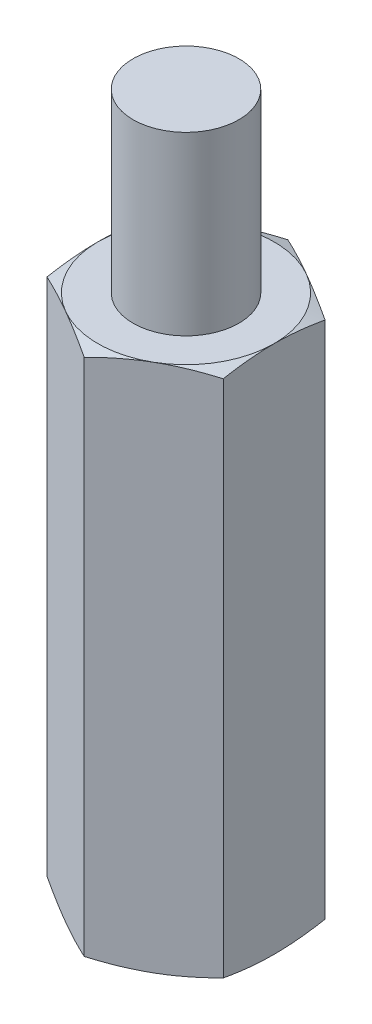
ISO-10303-21;
HEADER;
FILE_DESCRIPTION(('STEP AP214'),'2;1');
FILE_NAME('part.step','',(''),(''),'','','');
FILE_SCHEMA(('AUTOMOTIVE_DESIGN { 1 0 10303 214 1 1 1 1 }'));
ENDSEC;
DATA;
#1=APPLICATION_CONTEXT('core data for automotive mechanical design processes');
#2=APPLICATION_PROTOCOL_DEFINITION('international standard','automotive_design',2000,#1);
#3=PRODUCT_CONTEXT('',#1,'mechanical');
#4=PRODUCT('Part','Part','',(#3));
#5=PRODUCT_RELATED_PRODUCT_CATEGORY('part','',(#4));
#6=PRODUCT_DEFINITION_FORMATION('','',#4);
#7=PRODUCT_DEFINITION_CONTEXT('part definition',#1,'design');
#8=PRODUCT_DEFINITION('design','',#6,#7);
#9=PRODUCT_DEFINITION_SHAPE('','',#8);
#10=(LENGTH_UNIT() NAMED_UNIT(*) SI_UNIT(.MILLI.,.METRE.));
#11=(NAMED_UNIT(*) PLANE_ANGLE_UNIT() SI_UNIT($,.RADIAN.));
#12=(NAMED_UNIT(*) SI_UNIT($,.STERADIAN.) SOLID_ANGLE_UNIT());
#13=UNCERTAINTY_MEASURE_WITH_UNIT(LENGTH_MEASURE(1.E-05),#10,'distance_accuracy_value','');
#14=(GEOMETRIC_REPRESENTATION_CONTEXT(3) GLOBAL_UNCERTAINTY_ASSIGNED_CONTEXT((#13)) GLOBAL_UNIT_ASSIGNED_CONTEXT((#10,
#11,#12)) REPRESENTATION_CONTEXT('',''));
#15=CARTESIAN_POINT('',(0.,0.,0.));
#16=DIRECTION('',(0.,0.,1.));
#17=DIRECTION('',(1.,0.,0.));
#18=AXIS2_PLACEMENT_3D('',#15,#16,#17);
#19=CARTESIAN_POINT('',(0.,20.,0.));
#20=DIRECTION('',(0.,-1.,0.));
#21=DIRECTION('',(0.,0.,-1.));
#22=AXIS2_PLACEMENT_3D('',#19,#20,#21);
#23=CYLINDRICAL_SURFACE('',#22,1.5);
#24=CARTESIAN_POINT('',(0.,20.,0.));
#25=DIRECTION('',(0.,1.,0.));
#26=DIRECTION('',(0.,0.,1.));
#27=AXIS2_PLACEMENT_3D('',#24,#25,#26);
#28=CIRCLE('',#27,1.5);
#29=CARTESIAN_POINT('',(0.,20.,1.5));
#30=VERTEX_POINT('',#29);
#31=EDGE_CURVE('E11',#30,#30,#28,.T.);
#32=ORIENTED_EDGE('',*,*,#31,.F.);
#33=EDGE_LOOP('',(#32));
#34=FACE_BOUND('',#33,.T.);
#35=CARTESIAN_POINT('',(0.,15.,0.));
#36=DIRECTION('',(0.,1.,0.));
#37=DIRECTION('',(0.,0.,1.));
#38=AXIS2_PLACEMENT_3D('',#35,#36,#37);
#39=CIRCLE('',#38,1.5);
#40=CARTESIAN_POINT('',(0.,15.,1.5));
#41=VERTEX_POINT('',#40);
#42=EDGE_CURVE('E52',#41,#41,#39,.T.);
#43=ORIENTED_EDGE('',*,*,#42,.T.);
#44=EDGE_LOOP('',(#43));
#45=FACE_BOUND('',#44,.T.);
#46=ADVANCED_FACE('F49',(#34,#45),#23,.T.);
#47=CARTESIAN_POINT('',(0.,20.,0.));
#48=DIRECTION('',(0.,1.,0.));
#49=DIRECTION('',(0.,0.,1.));
#50=AXIS2_PLACEMENT_3D('',#47,#48,#49);
#51=PLANE('',#50);
#52=ORIENTED_EDGE('',*,*,#31,.T.);
#53=EDGE_LOOP('',(#52));
#54=FACE_BOUND('',#53,.T.);
#55=ADVANCED_FACE('F64',(#54),#51,.T.);
#56=CARTESIAN_POINT('',(0.,15.,0.));
#57=DIRECTION('',(0.,1.,0.));
#58=DIRECTION('',(0.,0.,1.));
#59=AXIS2_PLACEMENT_3D('',#56,#57,#58);
#60=PLANE('',#59);
#61=ORIENTED_EDGE('',*,*,#42,.F.);
#62=EDGE_LOOP('',(#61));
#63=FACE_BOUND('',#62,.T.);
#64=ADVANCED_FACE('F62',(#63),#60,.F.);
#65=CLOSED_SHELL('',(#46,#55,#64));
#66=MANIFOLD_SOLID_BREP('B2',#65);
#67=CARTESIAN_POINT('',(0.,15.,0.));
#68=DIRECTION('',(0.,1.,0.));
#69=DIRECTION('',(0.,0.,1.));
#70=AXIS2_PLACEMENT_3D('',#67,#68,#69);
#71=PLANE('',#70);
#72=CARTESIAN_POINT('',(0.,15.,0.));
#73=DIRECTION('',(0.,-1.,0.));
#74=DIRECTION('',(0.,0.,-1.));
#75=AXIS2_PLACEMENT_3D('',#72,#73,#74);
#76=CIRCLE('',#75,2.5);
#77=CARTESIAN_POINT('',(-1.24999999999999,15.,2.1650635094611));
#78=VERTEX_POINT('',#77);
#79=CARTESIAN_POINT('',(-2.5,15.,0.));
#80=VERTEX_POINT('',#79);
#81=EDGE_CURVE('E391',#78,#80,#76,.T.);
#82=ORIENTED_EDGE('',*,*,#81,.F.);
#83=CARTESIAN_POINT('',(1.25000000000002,15.,2.16506350946109));
#84=VERTEX_POINT('',#83);
#85=EDGE_CURVE('E389',#84,#78,#76,.T.);
#86=ORIENTED_EDGE('',*,*,#85,.F.);
#87=CARTESIAN_POINT('',(2.5,15.,0.));
#88=VERTEX_POINT('',#87);
#89=EDGE_CURVE('E387',#88,#84,#76,.T.);
#90=ORIENTED_EDGE('',*,*,#89,.F.);
#91=CARTESIAN_POINT('',(1.24999999999999,15.,-2.16506350946111));
#92=VERTEX_POINT('',#91);
#93=EDGE_CURVE('E294',#92,#88,#76,.T.);
#94=ORIENTED_EDGE('',*,*,#93,.F.);
#95=CARTESIAN_POINT('',(-1.25,15.,-2.1650635094611));
#96=VERTEX_POINT('',#95);
#97=EDGE_CURVE('E390',#96,#92,#76,.T.);
#98=ORIENTED_EDGE('',*,*,#97,.F.);
#99=EDGE_CURVE('E395',#80,#96,#76,.T.);
#100=ORIENTED_EDGE('',*,*,#99,.F.);
#101=EDGE_LOOP('',(#82,#86,#90,#94,#98,#100));
#102=FACE_BOUND('',#101,.T.);
#103=CARTESIAN_POINT('',(0.,15.,0.));
#104=DIRECTION('',(0.,1.,0.));
#105=DIRECTION('',(0.,0.,1.));
#106=AXIS2_PLACEMENT_3D('',#103,#104,#105);
#107=CIRCLE('',#106,1.5);
#108=CARTESIAN_POINT('',(0.,15.,1.5));
#109=VERTEX_POINT('',#108);
#110=EDGE_CURVE('E357',#109,#109,#107,.T.);
#111=ORIENTED_EDGE('',*,*,#110,.F.);
#112=EDGE_LOOP('',(#111));
#113=FACE_BOUND('',#112,.T.);
#114=ADVANCED_FACE('F84',(#102,#113),#71,.T.);
#115=CARTESIAN_POINT('',(0.,0.,0.));
#116=DIRECTION('',(0.,1.,0.));
#117=DIRECTION('',(0.,0.,1.));
#118=AXIS2_PLACEMENT_3D('',#115,#116,#117);
#119=PLANE('',#118);
#120=CARTESIAN_POINT('',(0.,0.,0.));
#121=DIRECTION('',(0.,-1.,0.));
#122=DIRECTION('',(0.,0.,-1.));
#123=AXIS2_PLACEMENT_3D('',#120,#121,#122);
#124=CIRCLE('',#123,2.5);
#125=CARTESIAN_POINT('',(1.25000000000002,0.,2.16506350946109));
#126=VERTEX_POINT('',#125);
#127=CARTESIAN_POINT('',(-1.24999999999999,0.,2.1650635094611));
#128=VERTEX_POINT('',#127);
#129=EDGE_CURVE('E189',#126,#128,#124,.T.);
#130=ORIENTED_EDGE('',*,*,#129,.T.);
#131=CARTESIAN_POINT('',(-2.5,0.,0.));
#132=VERTEX_POINT('',#131);
#133=EDGE_CURVE('E212',#128,#132,#124,.T.);
#134=ORIENTED_EDGE('',*,*,#133,.T.);
#135=CARTESIAN_POINT('',(-1.25,0.,-2.1650635094611));
#136=VERTEX_POINT('',#135);
#137=EDGE_CURVE('E211',#132,#136,#124,.T.);
#138=ORIENTED_EDGE('',*,*,#137,.T.);
#139=CARTESIAN_POINT('',(1.24999999999999,0.,-2.16506350946111));
#140=VERTEX_POINT('',#139);
#141=EDGE_CURVE('E208',#136,#140,#124,.T.);
#142=ORIENTED_EDGE('',*,*,#141,.T.);
#143=CARTESIAN_POINT('',(2.5,0.,0.));
#144=VERTEX_POINT('',#143);
#145=EDGE_CURVE('E106',#140,#144,#124,.T.);
#146=ORIENTED_EDGE('',*,*,#145,.T.);
#147=EDGE_CURVE('E182',#144,#126,#124,.T.);
#148=ORIENTED_EDGE('',*,*,#147,.T.);
#149=EDGE_LOOP('',(#130,#134,#138,#142,#146,#148));
#150=FACE_BOUND('',#149,.T.);
#151=CARTESIAN_POINT('',(0.,0.,0.));
#152=DIRECTION('',(0.,1.,0.));
#153=DIRECTION('',(0.,0.,1.));
#154=AXIS2_PLACEMENT_3D('',#151,#152,#153);
#155=CIRCLE('',#154,1.5);
#156=CARTESIAN_POINT('',(0.,0.,1.5));
#157=VERTEX_POINT('',#156);
#158=EDGE_CURVE('E360',#157,#157,#155,.T.);
#159=ORIENTED_EDGE('',*,*,#158,.T.);
#160=EDGE_LOOP('',(#159));
#161=FACE_BOUND('',#160,.T.);
#162=ADVANCED_FACE('F205',(#150,#161),#119,.F.);
#163=CARTESIAN_POINT('',(2.49999999999998,15.,-1.44337567297409));
#164=DIRECTION('',(-0.499999999999995,0.,0.866025403784442));
#165=DIRECTION('',(0.866025403784442,0.,0.499999999999995));
#166=AXIS2_PLACEMENT_3D('',#163,#164,#165);
#167=PLANE('',#166);
#168=DIRECTION('',(0.,-1.,0.));
#169=VECTOR('',#168,1.);
#170=CARTESIAN_POINT('',(2.49999999999998,15.,-1.44337567297409));
#171=LINE('',#170,#169);
#172=CARTESIAN_POINT('',(2.49999999999998,14.8592340220125,-1.44337567297409));
#173=VERTEX_POINT('',#172);
#174=CARTESIAN_POINT('',(2.49999999999998,0.140765977987508,-1.44337567297409));
#175=VERTEX_POINT('',#174);
#176=EDGE_CURVE('E363',#173,#175,#171,.T.);
#177=ORIENTED_EDGE('',*,*,#176,.T.);
#178=CARTESIAN_POINT('',(2.50019999999998,0.140808008171613,-1.44326020292026));
#179=CARTESIAN_POINT('',(2.39665305132346,0.119039069131316,-1.50304306161241));
#180=CARTESIAN_POINT('',(2.29276461388714,0.09923632869972,-1.56302307893196));
#181=CARTESIAN_POINT('',(2.08431213823202,0.0643963200817531,-1.68337317186468));
#182=CARTESIAN_POINT('',(1.97974763612162,0.0493627822141141,-1.7437435153058));
#183=CARTESIAN_POINT('',(1.77110364851345,0.0250464111610833,-1.86420417771618));
#184=CARTESIAN_POINT('',(1.6670289296066,0.0157105319226292,-1.92429174469288));
#185=CARTESIAN_POINT('',(1.45863606978594,0.00318847973073288,-2.04460741840753));
#186=CARTESIAN_POINT('',(1.35431803489297,0.,-2.10483546393432));
#187=CARTESIAN_POINT('',(1.14568196510702,0.,-2.2252915549879));
#188=CARTESIAN_POINT('',(1.04136393021405,0.00318847973073293,-2.28551960051469));
#189=CARTESIAN_POINT('',(0.832971070393384,0.0157105319226293,-2.40583527422935));
#190=CARTESIAN_POINT('',(0.728896351486535,0.0250464111610833,-2.46592284120605));
#191=CARTESIAN_POINT('',(0.520252363878367,0.0493627822141141,-2.58638350361642));
#192=CARTESIAN_POINT('',(0.41568786176796,0.0643963200817531,-2.64675384705754));
#193=CARTESIAN_POINT('',(0.207235386112847,0.09923632869972,-2.76710393999026));
#194=CARTESIAN_POINT('',(0.103346948676526,0.119039069131316,-2.82708395730981));
#195=CARTESIAN_POINT('',(-0.000200000000000308,0.140808008171613,-2.88686681600197));
#196=B_SPLINE_CURVE_WITH_KNOTS('',3,(#178,#179,#180,#181,#182,#183,#184,#185,#186,#187,#188,
#189,#190,#191,#192,#193,#194,#195),.UNSPECIFIED.,.F.,.F.,(4,2,2,2,2,2,2,2,4),(0.,
0.364631406980056,0.729547317866326,1.09101180768958,1.45234063356534,1.8136694594411,
2.17513394926436,2.54004986015063,2.90468126713069),.UNSPECIFIED.);
#197=EDGE_CURVE('E194',#175,#140,#196,.T.);
#198=ORIENTED_EDGE('',*,*,#197,.T.);
#199=CARTESIAN_POINT('',(0.,0.140765977987508,-2.88675134594813));
#200=VERTEX_POINT('',#199);
#201=EDGE_CURVE('E402',#140,#200,#196,.T.);
#202=ORIENTED_EDGE('',*,*,#201,.T.);
#203=DIRECTION('',(0.,-1.,0.));
#204=VECTOR('',#203,1.);
#205=CARTESIAN_POINT('',(0.,15.,-2.88675134594813));
#206=LINE('',#205,#204);
#207=CARTESIAN_POINT('',(0.,14.8592340220125,-2.88675134594813));
#208=VERTEX_POINT('',#207);
#209=EDGE_CURVE('E373',#208,#200,#206,.T.);
#210=ORIENTED_EDGE('',*,*,#209,.F.);
#211=CARTESIAN_POINT('',(-0.0002,14.8591919918284,-2.88686681600197));
#212=CARTESIAN_POINT('',(0.103346948676526,14.8809609308687,-2.82708395730981));
#213=CARTESIAN_POINT('',(0.207235386112847,14.9007636713003,-2.76710393999026));
#214=CARTESIAN_POINT('',(0.41568786176796,14.9356036799182,-2.64675384705754));
#215=CARTESIAN_POINT('',(0.520252363878367,14.9506372177859,-2.58638350361642));
#216=CARTESIAN_POINT('',(0.728896351486535,14.9749535888389,-2.46592284120605));
#217=CARTESIAN_POINT('',(0.832971070393384,14.9842894680774,-2.40583527422935));
#218=CARTESIAN_POINT('',(1.04136393021405,14.9968115202693,-2.28551960051469));
#219=CARTESIAN_POINT('',(1.14568196510702,15.,-2.2252915549879));
#220=CARTESIAN_POINT('',(1.35431803489297,15.,-2.10483546393432));
#221=CARTESIAN_POINT('',(1.45863606978594,14.9968115202693,-2.04460741840753));
#222=CARTESIAN_POINT('',(1.6670289296066,14.9842894680774,-1.92429174469288));
#223=CARTESIAN_POINT('',(1.77110364851345,14.9749535888389,-1.86420417771618));
#224=CARTESIAN_POINT('',(1.97974763612162,14.9506372177859,-1.74374351530581));
#225=CARTESIAN_POINT('',(2.08431213823202,14.9356036799182,-1.68337317186468));
#226=CARTESIAN_POINT('',(2.29276461388714,14.9007636713003,-1.56302307893196));
#227=CARTESIAN_POINT('',(2.39665305132346,14.8809609308687,-1.50304306161241));
#228=CARTESIAN_POINT('',(2.50019999999998,14.8591919918284,-1.44326020292026));
#229=B_SPLINE_CURVE_WITH_KNOTS('',3,(#211,#212,#213,#214,#215,#216,#217,#218,#219,#220,#221,
#222,#223,#224,#225,#226,#227,#228),.UNSPECIFIED.,.F.,.F.,(4,2,2,2,2,2,2,2,4),(0.,
0.364631406980055,0.729547317866326,1.09101180768958,1.45234063356534,1.8136694594411,
2.17513394926436,2.54004986015063,2.90468126713068),.UNSPECIFIED.);
#230=EDGE_CURVE('E302',#208,#92,#229,.T.);
#231=ORIENTED_EDGE('',*,*,#230,.T.);
#232=EDGE_CURVE('E293',#92,#173,#229,.T.);
#233=ORIENTED_EDGE('',*,*,#232,.T.);
#234=EDGE_LOOP('',(#177,#198,#202,#210,#231,#233));
#235=FACE_BOUND('',#234,.T.);
#236=ADVANCED_FACE('F86',(#235),#167,.F.);
#237=CARTESIAN_POINT('',(0.,15.,-2.88675134594813));
#238=DIRECTION('',(0.500000000000001,0.,0.866025403784438));
#239=DIRECTION('',(0.866025403784438,0.,-0.500000000000001));
#240=AXIS2_PLACEMENT_3D('',#237,#238,#239);
#241=PLANE('',#240);
#242=ORIENTED_EDGE('',*,*,#209,.T.);
#243=CARTESIAN_POINT('',(0.000200000000000055,0.140808008171613,-2.88686681600197));
#244=CARTESIAN_POINT('',(-0.103346948676527,0.119039069131316,-2.82708395730981));
#245=CARTESIAN_POINT('',(-0.207235386112849,0.0992363286997191,-2.76710393999026));
#246=CARTESIAN_POINT('',(-0.415687861767963,0.0643963200817513,-2.64675384705754));
#247=CARTESIAN_POINT('',(-0.520252363878371,0.0493627822141118,-2.58638350361641));
#248=CARTESIAN_POINT('',(-0.728896351486541,0.0250464111610803,-2.46592284120604));
#249=CARTESIAN_POINT('',(-0.832971070393391,0.015710531922626,-2.40583527422933));
#250=CARTESIAN_POINT('',(-1.04136393021405,0.00318847973072929,-2.28551960051468));
#251=CARTESIAN_POINT('',(-1.14568196510703,0.,-2.22529155498789));
#252=CARTESIAN_POINT('',(-1.35431803489298,0.,-2.1048354639343));
#253=CARTESIAN_POINT('',(-1.45863606978595,0.00318847973072927,-2.04460741840751));
#254=CARTESIAN_POINT('',(-1.66702892960661,0.0157105319226259,-1.92429174469286));
#255=CARTESIAN_POINT('',(-1.77110364851346,0.0250464111610802,-1.86420417771615));
#256=CARTESIAN_POINT('',(-1.97974763612163,0.0493627822141117,-1.74374351530578));
#257=CARTESIAN_POINT('',(-2.08431213823204,0.0643963200817511,-1.68337317186465));
#258=CARTESIAN_POINT('',(-2.29276461388716,0.099236328699719,-1.56302307893193));
#259=CARTESIAN_POINT('',(-2.39665305132348,0.119039069131316,-1.50304306161238));
#260=CARTESIAN_POINT('',(-2.5002,0.140808008171613,-1.44326020292022));
#261=B_SPLINE_CURVE_WITH_KNOTS('',3,(#243,#244,#245,#246,#247,#248,#249,#250,#251,#252,#253,
#254,#255,#256,#257,#258,#259,#260),.UNSPECIFIED.,.F.,.F.,(4,2,2,2,2,2,2,2,4),(0.,
0.36463140698006,0.729547317866335,1.0910118076896,1.45234063356536,1.81366945944112,
2.17513394926439,2.54004986015066,2.90468126713072),.UNSPECIFIED.);
#262=EDGE_CURVE('E240',#200,#136,#261,.T.);
#263=ORIENTED_EDGE('',*,*,#262,.T.);
#264=CARTESIAN_POINT('',(-2.5,0.140765977987508,-1.44337567297406));
#265=VERTEX_POINT('',#264);
#266=EDGE_CURVE('E239',#136,#265,#261,.T.);
#267=ORIENTED_EDGE('',*,*,#266,.T.);
#268=DIRECTION('',(0.,-1.,0.));
#269=VECTOR('',#268,1.);
#270=CARTESIAN_POINT('',(-2.5,15.,-1.44337567297406));
#271=LINE('',#270,#269);
#272=CARTESIAN_POINT('',(-2.5,14.8592340220125,-1.44337567297406));
#273=VERTEX_POINT('',#272);
#274=EDGE_CURVE('E235',#273,#265,#271,.T.);
#275=ORIENTED_EDGE('',*,*,#274,.F.);
#276=CARTESIAN_POINT('',(-2.5002,14.8591919918284,-1.44326020292022));
#277=CARTESIAN_POINT('',(-2.39665305132348,14.8809609308687,-1.50304306161238));
#278=CARTESIAN_POINT('',(-2.29276461388716,14.9007636713003,-1.56302307893193));
#279=CARTESIAN_POINT('',(-2.08431213823204,14.9356036799182,-1.68337317186465));
#280=CARTESIAN_POINT('',(-1.97974763612163,14.9506372177859,-1.74374351530578));
#281=CARTESIAN_POINT('',(-1.77110364851346,14.9749535888389,-1.86420417771615));
#282=CARTESIAN_POINT('',(-1.66702892960661,14.9842894680774,-1.92429174469286));
#283=CARTESIAN_POINT('',(-1.45863606978595,14.9968115202693,-2.04460741840751));
#284=CARTESIAN_POINT('',(-1.35431803489298,15.,-2.1048354639343));
#285=CARTESIAN_POINT('',(-1.14568196510703,15.,-2.22529155498789));
#286=CARTESIAN_POINT('',(-1.04136393021405,14.9968115202693,-2.28551960051468));
#287=CARTESIAN_POINT('',(-0.832971070393391,14.9842894680774,-2.40583527422933));
#288=CARTESIAN_POINT('',(-0.728896351486541,14.9749535888389,-2.46592284120604));
#289=CARTESIAN_POINT('',(-0.520252363878371,14.9506372177859,-2.58638350361641));
#290=CARTESIAN_POINT('',(-0.415687861767963,14.9356036799182,-2.64675384705754));
#291=CARTESIAN_POINT('',(-0.207235386112849,14.9007636713003,-2.76710393999026));
#292=CARTESIAN_POINT('',(-0.103346948676527,14.8809609308687,-2.82708395730981));
#293=CARTESIAN_POINT('',(0.000199999999999991,14.8591919918284,-2.88686681600197));
#294=B_SPLINE_CURVE_WITH_KNOTS('',3,(#276,#277,#278,#279,#280,#281,#282,#283,#284,#285,#286,
#287,#288,#289,#290,#291,#292,#293),.UNSPECIFIED.,.F.,.F.,(4,2,2,2,2,2,2,2,4),(0.,
0.364631406980061,0.729547317866335,1.0910118076896,1.45234063356536,1.81366945944113,
2.17513394926439,2.54004986015066,2.90468126713072),.UNSPECIFIED.);
#295=EDGE_CURVE('E318',#273,#96,#294,.T.);
#296=ORIENTED_EDGE('',*,*,#295,.T.);
#297=EDGE_CURVE('E310',#96,#208,#294,.T.);
#298=ORIENTED_EDGE('',*,*,#297,.T.);
#299=EDGE_LOOP('',(#242,#263,#267,#275,#296,#298));
#300=FACE_BOUND('',#299,.T.);
#301=ADVANCED_FACE('F325',(#300),#241,.F.);
#302=CARTESIAN_POINT('',(-2.5,15.,-1.44337567297406));
#303=DIRECTION('',(1.,0.,0.));
#304=DIRECTION('',(0.,0.,-1.));
#305=AXIS2_PLACEMENT_3D('',#302,#303,#304);
#306=PLANE('',#305);
#307=ORIENTED_EDGE('',*,*,#274,.T.);
#308=CARTESIAN_POINT('',(-2.50000000000001,0.9110699184983,-4.33375705030874));
#309=CARTESIAN_POINT('',(-2.50000000000001,0.857151962741823,-4.1626121487893));
#310=CARTESIAN_POINT('',(-2.50000000000001,0.803889247670853,-3.99125292656234));
#311=CARTESIAN_POINT('',(-2.50000000000001,0.699303356408641,-3.64790122960471));
#312=CARTESIAN_POINT('',(-2.50000000000001,0.647980635713855,-3.47590861643412));
#313=CARTESIAN_POINT('',(-2.50000000000001,0.547192255797207,-3.12862476065282));
#314=CARTESIAN_POINT('',(-2.50000000000001,0.497765115102524,-2.95332226186824));
#315=CARTESIAN_POINT('',(-2.50000000000001,0.402640277745627,-2.60170577064686));
#316=CARTESIAN_POINT('',(-2.50000000000001,0.356942439150253,-2.42539181697853));
#317=CARTESIAN_POINT('',(-2.50000000000001,0.272638394402247,-2.07901596617803));
#318=CARTESIAN_POINT('',(-2.50000000000001,0.233812857215179,-1.90900813322598));
#319=CARTESIAN_POINT('',(-2.50000000000001,0.162867038370292,-1.56755699875984));
#320=CARTESIAN_POINT('',(-2.5,0.13074720665615,-1.39611360172362));
#321=CARTESIAN_POINT('',(-2.5,0.0758518227791731,-1.05306244520638));
#322=CARTESIAN_POINT('',(-2.5,0.0530056159219257,-0.881466309778352));
#323=CARTESIAN_POINT('',(-2.5,0.0188225697475301,-0.53712766793492));
#324=CARTESIAN_POINT('',(-2.5,0.0074816908407242,-0.364385585324937));
#325=CARTESIAN_POINT('',(-2.5,4.41044611649526E-05,-0.0973938847143227));
#326=CARTESIAN_POINT('',(-2.5,-0.000644888189889895,-0.00325681931261538));
#327=CARTESIAN_POINT('',(-2.5,0.00184631107398246,0.184970103743134));
#328=CARTESIAN_POINT('',(-2.5,0.00502655264592196,0.279059960775809));
#329=CARTESIAN_POINT('',(-2.5,0.0151239518844856,0.467060430735544));
#330=CARTESIAN_POINT('',(-2.5,0.0220420903773748,0.560970990121225));
#331=CARTESIAN_POINT('',(-2.5,0.0393313521905001,0.748477331015576));
#332=CARTESIAN_POINT('',(-2.5,0.0497028075871388,0.842073081377065));
#333=CARTESIAN_POINT('',(-2.5,0.0856400575240468,1.12380926395691));
#334=CARTESIAN_POINT('',(-2.5,0.115934676805282,1.31134961033416));
#335=CARTESIAN_POINT('',(-2.49999999999999,0.18575752105665,1.68464568549846));
#336=CARTESIAN_POINT('',(-2.49999999999999,0.225286525445446,1.87040126226527));
#337=CARTESIAN_POINT('',(-2.49999999999999,0.312868160934001,2.24929384309448));
#338=CARTESIAN_POINT('',(-2.49999999999999,0.361239314019708,2.44235614952976));
#339=CARTESIAN_POINT('',(-2.49999999999999,0.462845732200086,2.8271740656917));
#340=CARTESIAN_POINT('',(-2.49999999999999,0.516080908992449,3.01892969907206));
#341=CARTESIAN_POINT('',(-2.49999999999999,0.625017863722871,3.3982782674358));
#342=CARTESIAN_POINT('',(-2.49999999999999,0.680663797121248,3.58588734311865));
#343=CARTESIAN_POINT('',(-2.49999999999999,0.765880720880509,3.86673968266628));
#344=CARTESIAN_POINT('',(-2.49999999999999,0.794573796432844,3.96025127643636));
#345=CARTESIAN_POINT('',(-2.49999999999999,0.852463883475562,4.14711653548762));
#346=CARTESIAN_POINT('',(-2.49999999999999,0.881660885655854,4.24047020365159));
#347=CARTESIAN_POINT('',(-2.49999999999999,0.9110699184983,4.33375705030875));
#348=B_SPLINE_CURVE_WITH_KNOTS('',3,(#308,#309,#310,#311,#312,#313,#314,#315,#316,#317,#318,
#319,#320,#321,#322,#323,#324,#325,#326,#327,#328,#329,#330,#331,#332,#333,#334,#335,#336,#337,
#338,#339,#340,#341,#342,#343,#344,#345,#346,#347),.UNSPECIFIED.,.F.,.F.,(4,2,2,2,2,2,2,2,2,2,2,
2,2,2,2,2,2,2,2,4),(0.,0.538321778022803,1.07676917474349,1.62315243554878,2.1695148918972,
2.69257527905727,3.21567075158281,3.73470243407135,4.25355181828759,4.53589900114561,
4.81824980763162,5.100674739136,5.38312683691471,5.95267633652753,6.52227392575273,
7.11926798158166,7.71625120163243,8.3032921668782,8.59673518713049,8.89017279178627),.UNSPECIFIED.);
#349=EDGE_CURVE('E229',#265,#132,#348,.T.);
#350=ORIENTED_EDGE('',*,*,#349,.T.);
#351=CARTESIAN_POINT('',(-2.49999999999999,0.140765977987508,1.44337567297408));
#352=VERTEX_POINT('',#351);
#353=EDGE_CURVE('E225',#132,#352,#348,.T.);
#354=ORIENTED_EDGE('',*,*,#353,.T.);
#355=DIRECTION('',(0.,-1.,0.));
#356=VECTOR('',#355,1.);
#357=CARTESIAN_POINT('',(-2.5,15.,1.44337567297408));
#358=LINE('',#357,#356);
#359=CARTESIAN_POINT('',(-2.49999999999999,14.8592340220125,1.44337567297408));
#360=VERTEX_POINT('',#359);
#361=EDGE_CURVE('E370',#360,#352,#358,.T.);
#362=ORIENTED_EDGE('',*,*,#361,.F.);
#363=CARTESIAN_POINT('',(-2.49999999999999,14.0889300815017,4.33375705030875));
#364=CARTESIAN_POINT('',(-2.49999999999999,14.1428480372582,4.16261214878932));
#365=CARTESIAN_POINT('',(-2.49999999999999,14.1961107523291,3.99125292656235));
#366=CARTESIAN_POINT('',(-2.49999999999999,14.3006966435914,3.64790122960472));
#367=CARTESIAN_POINT('',(-2.49999999999999,14.3520193642861,3.47590861643413));
#368=CARTESIAN_POINT('',(-2.49999999999999,14.4528077442028,3.12862476065284));
#369=CARTESIAN_POINT('',(-2.49999999999999,14.5022348848975,2.95332226186826));
#370=CARTESIAN_POINT('',(-2.49999999999999,14.5973597222544,2.60170577064688));
#371=CARTESIAN_POINT('',(-2.49999999999999,14.6430575608497,2.42539181697855));
#372=CARTESIAN_POINT('',(-2.49999999999999,14.7273616055978,2.07901596617805));
#373=CARTESIAN_POINT('',(-2.49999999999999,14.7661871427848,1.909008133226));
#374=CARTESIAN_POINT('',(-2.49999999999999,14.8371329616297,1.56755699875986));
#375=CARTESIAN_POINT('',(-2.5,14.8692527933438,1.39611360172364));
#376=CARTESIAN_POINT('',(-2.5,14.9241481772208,1.0530624452064));
#377=CARTESIAN_POINT('',(-2.5,14.9469943840781,0.881466309778373));
#378=CARTESIAN_POINT('',(-2.5,14.9811774302525,0.537127667934941));
#379=CARTESIAN_POINT('',(-2.5,14.9925183091593,0.364385585324958));
#380=CARTESIAN_POINT('',(-2.5,14.9999558955388,0.0973938847143442));
#381=CARTESIAN_POINT('',(-2.5,15.0006448881899,0.00325681931263691));
#382=CARTESIAN_POINT('',(-2.5,14.998153688926,-0.184970103743112));
#383=CARTESIAN_POINT('',(-2.5,14.9949734473541,-0.279059960775788));
#384=CARTESIAN_POINT('',(-2.5,14.9848760481155,-0.467060430735524));
#385=CARTESIAN_POINT('',(-2.5,14.9779579096226,-0.560970990121205));
#386=CARTESIAN_POINT('',(-2.5,14.9606686478095,-0.748477331015556));
#387=CARTESIAN_POINT('',(-2.5,14.9502971924129,-0.842073081377046));
#388=CARTESIAN_POINT('',(-2.5,14.914359942476,-1.12380926395689));
#389=CARTESIAN_POINT('',(-2.5,14.8840653231947,-1.31134961033414));
#390=CARTESIAN_POINT('',(-2.50000000000001,14.8142424789434,-1.68464568549844));
#391=CARTESIAN_POINT('',(-2.50000000000001,14.7747134745546,-1.87040126226525));
#392=CARTESIAN_POINT('',(-2.50000000000001,14.687131839066,-2.24929384309446));
#393=CARTESIAN_POINT('',(-2.50000000000001,14.6387606859803,-2.44235614952974));
#394=CARTESIAN_POINT('',(-2.50000000000001,14.5371542677999,-2.82717406569169));
#395=CARTESIAN_POINT('',(-2.50000000000001,14.4839190910076,-3.01892969907204));
#396=CARTESIAN_POINT('',(-2.50000000000001,14.3749821362771,-3.39827826743578));
#397=CARTESIAN_POINT('',(-2.50000000000001,14.3193362028788,-3.58588734311863));
#398=CARTESIAN_POINT('',(-2.50000000000001,14.2341192791195,-3.86673968266627));
#399=CARTESIAN_POINT('',(-2.50000000000001,14.2054262035672,-3.96025127643634));
#400=CARTESIAN_POINT('',(-2.50000000000001,14.1475361165244,-4.14711653548761));
#401=CARTESIAN_POINT('',(-2.50000000000001,14.1183391143441,-4.24047020365157));
#402=CARTESIAN_POINT('',(-2.50000000000001,14.0889300815017,-4.33375705030874));
#403=B_SPLINE_CURVE_WITH_KNOTS('',3,(#363,#364,#365,#366,#367,#368,#369,#370,#371,#372,#373,
#374,#375,#376,#377,#378,#379,#380,#381,#382,#383,#384,#385,#386,#387,#388,#389,#390,#391,#392,
#393,#394,#395,#396,#397,#398,#399,#400,#401,#402),.UNSPECIFIED.,.F.,.F.,(4,2,2,2,2,2,2,2,2,2,2,
2,2,2,2,2,2,2,2,4),(0.,0.538321778022802,1.07676917474349,1.62315243554878,2.1695148918972,
2.69257527905726,3.21567075158281,3.73470243407135,4.25355181828758,4.5358990011456,
4.81824980763162,5.10067473913599,5.3831268369147,5.95267633652753,6.52227392575273,
7.11926798158166,7.71625120163243,8.3032921668782,8.59673518713049,8.89017279178627),.UNSPECIFIED.);
#404=EDGE_CURVE('E361',#360,#80,#403,.T.);
#405=ORIENTED_EDGE('',*,*,#404,.T.);
#406=EDGE_CURVE('E319',#80,#273,#403,.T.);
#407=ORIENTED_EDGE('',*,*,#406,.T.);
#408=EDGE_LOOP('',(#307,#350,#354,#362,#405,#407));
#409=FACE_BOUND('',#408,.T.);
#410=ADVANCED_FACE('F232',(#409),#306,.F.);
#411=CARTESIAN_POINT('',(-2.5,15.,1.44337567297408));
#412=DIRECTION('',(0.499999999999995,0.,-0.866025403784442));
#413=DIRECTION('',(-0.866025403784442,0.,-0.499999999999995));
#414=AXIS2_PLACEMENT_3D('',#411,#412,#413);
#415=PLANE('',#414);
#416=ORIENTED_EDGE('',*,*,#361,.T.);
#417=CARTESIAN_POINT('',(-2.5002,0.140808008171613,1.44326020292024));
#418=CARTESIAN_POINT('',(-2.39665305132347,0.119039069131316,1.5030430616124));
#419=CARTESIAN_POINT('',(-2.29276461388715,0.0992363286997191,1.56302307893195));
#420=CARTESIAN_POINT('',(-2.08431213823203,0.0643963200817513,1.68337317186467));
#421=CARTESIAN_POINT('',(-1.97974763612162,0.0493627822141118,1.74374351530579));
#422=CARTESIAN_POINT('',(-1.77110364851345,0.0250464111610802,1.86420417771616));
#423=CARTESIAN_POINT('',(-1.6670289296066,0.0157105319226259,1.92429174469287));
#424=CARTESIAN_POINT('',(-1.45863606978594,0.00318847973072917,2.04460741840752));
#425=CARTESIAN_POINT('',(-1.35431803489296,0.,2.10483546393431));
#426=CARTESIAN_POINT('',(-1.14568196510701,0.,2.22529155498789));
#427=CARTESIAN_POINT('',(-1.04136393021404,0.00318847973072924,2.28551960051469));
#428=CARTESIAN_POINT('',(-0.832971070393375,0.0157105319226259,2.40583527422934));
#429=CARTESIAN_POINT('',(-0.728896351486524,0.0250464111610802,2.46592284120604));
#430=CARTESIAN_POINT('',(-0.520252363878353,0.0493627822141116,2.58638350361642));
#431=CARTESIAN_POINT('',(-0.415687861767945,0.064396320081751,2.64675384705754));
#432=CARTESIAN_POINT('',(-0.20723538611283,0.0992363286997188,2.76710393999026));
#433=CARTESIAN_POINT('',(-0.103346948676507,0.119039069131316,2.82708395730981));
#434=CARTESIAN_POINT('',(0.000200000000020177,0.140808008171613,2.88686681600197));
#435=B_SPLINE_CURVE_WITH_KNOTS('',3,(#417,#418,#419,#420,#421,#422,#423,#424,#425,#426,#427,
#428,#429,#430,#431,#432,#433,#434),.UNSPECIFIED.,.F.,.F.,(4,2,2,2,2,2,2,2,4),(0.,
0.364631406980059,0.729547317866335,1.0910118076896,1.45234063356536,1.81366945944112,
2.17513394926439,2.54004986015066,2.90468126713072),.UNSPECIFIED.);
#436=EDGE_CURVE('E114',#352,#128,#435,.T.);
#437=ORIENTED_EDGE('',*,*,#436,.T.);
#438=CARTESIAN_POINT('',(0.,0.140765977987508,2.88675134594813));
#439=VERTEX_POINT('',#438);
#440=EDGE_CURVE('E217',#128,#439,#435,.T.);
#441=ORIENTED_EDGE('',*,*,#440,.T.);
#442=DIRECTION('',(0.,-1.,0.));
#443=VECTOR('',#442,1.);
#444=CARTESIAN_POINT('',(0.,15.,2.88675134594813));
#445=LINE('',#444,#443);
#446=CARTESIAN_POINT('',(0.,14.8592340220125,2.88675134594813));
#447=VERTEX_POINT('',#446);
#448=EDGE_CURVE('E368',#447,#439,#445,.T.);
#449=ORIENTED_EDGE('',*,*,#448,.F.);
#450=CARTESIAN_POINT('',(0.000200000000020158,14.8591919918284,2.88686681600197));
#451=CARTESIAN_POINT('',(-0.103346948676507,14.8809609308687,2.82708395730981));
#452=CARTESIAN_POINT('',(-0.20723538611283,14.9007636713003,2.76710393999026));
#453=CARTESIAN_POINT('',(-0.415687861767945,14.9356036799182,2.64675384705754));
#454=CARTESIAN_POINT('',(-0.520252363878353,14.9506372177859,2.58638350361642));
#455=CARTESIAN_POINT('',(-0.728896351486524,14.9749535888389,2.46592284120604));
#456=CARTESIAN_POINT('',(-0.832971070393375,14.9842894680774,2.40583527422934));
#457=CARTESIAN_POINT('',(-1.04136393021404,14.9968115202693,2.28551960051469));
#458=CARTESIAN_POINT('',(-1.14568196510701,15.,2.22529155498789));
#459=CARTESIAN_POINT('',(-1.35431803489296,15.,2.10483546393431));
#460=CARTESIAN_POINT('',(-1.45863606978594,14.9968115202693,2.04460741840752));
#461=CARTESIAN_POINT('',(-1.6670289296066,14.9842894680774,1.92429174469287));
#462=CARTESIAN_POINT('',(-1.77110364851345,14.9749535888389,1.86420417771616));
#463=CARTESIAN_POINT('',(-1.97974763612162,14.9506372177859,1.74374351530579));
#464=CARTESIAN_POINT('',(-2.08431213823203,14.9356036799182,1.68337317186467));
#465=CARTESIAN_POINT('',(-2.29276461388715,14.9007636713003,1.56302307893195));
#466=CARTESIAN_POINT('',(-2.39665305132347,14.8809609308687,1.5030430616124));
#467=CARTESIAN_POINT('',(-2.5002,14.8591919918284,1.44326020292024));
#468=B_SPLINE_CURVE_WITH_KNOTS('',3,(#450,#451,#452,#453,#454,#455,#456,#457,#458,#459,#460,
#461,#462,#463,#464,#465,#466,#467),.UNSPECIFIED.,.F.,.F.,(4,2,2,2,2,2,2,2,4),(0.,
0.36463140698006,0.729547317866335,1.0910118076896,1.45234063356536,1.81366945944113,
2.17513394926439,2.54004986015066,2.90468126713072),.UNSPECIFIED.);
#469=EDGE_CURVE('E303',#447,#78,#468,.T.);
#470=ORIENTED_EDGE('',*,*,#469,.T.);
#471=EDGE_CURVE('E311',#78,#360,#468,.T.);
#472=ORIENTED_EDGE('',*,*,#471,.T.);
#473=EDGE_LOOP('',(#416,#437,#441,#449,#470,#472));
#474=FACE_BOUND('',#473,.T.);
#475=ADVANCED_FACE('F279',(#474),#415,.F.);
#476=CARTESIAN_POINT('',(0.,15.,2.88675134594813));
#477=DIRECTION('',(-0.500000000000007,0.,-0.866025403784435));
#478=DIRECTION('',(-0.866025403784435,0.,0.500000000000007));
#479=AXIS2_PLACEMENT_3D('',#476,#477,#478);
#480=PLANE('',#479);
#481=ORIENTED_EDGE('',*,*,#448,.T.);
#482=CARTESIAN_POINT('',(-0.000199999999979892,0.140808008171613,2.88686681600197));
#483=CARTESIAN_POINT('',(0.103346948676547,0.119039069131316,2.82708395730981));
#484=CARTESIAN_POINT('',(0.207235386112869,0.0992363286997187,2.76710393999026));
#485=CARTESIAN_POINT('',(0.415687861767982,0.064396320081751,2.64675384705753));
#486=CARTESIAN_POINT('',(0.520252363878389,0.0493627822141117,2.58638350361641));
#487=CARTESIAN_POINT('',(0.728896351486558,0.0250464111610802,2.46592284120603));
#488=CARTESIAN_POINT('',(0.832971070393408,0.015710531922626,2.40583527422933));
#489=CARTESIAN_POINT('',(1.04136393021407,0.00318847973072924,2.28551960051467));
#490=CARTESIAN_POINT('',(1.14568196510704,0.,2.22529155498788));
#491=CARTESIAN_POINT('',(1.35431803489299,0.,2.10483546393429));
#492=CARTESIAN_POINT('',(1.45863606978597,0.0031884797307292,2.0446074184075));
#493=CARTESIAN_POINT('',(1.66702892960663,0.0157105319226259,1.92429174469284));
#494=CARTESIAN_POINT('',(1.77110364851348,0.0250464111610802,1.86420417771614));
#495=CARTESIAN_POINT('',(1.97974763612165,0.0493627822141118,1.74374351530576));
#496=CARTESIAN_POINT('',(2.08431213823205,0.0643963200817513,1.68337317186464));
#497=CARTESIAN_POINT('',(2.29276461388717,0.0992363286997191,1.56302307893191));
#498=CARTESIAN_POINT('',(2.39665305132349,0.119039069131316,1.50304306161236));
#499=CARTESIAN_POINT('',(2.50020000000002,0.140808008171613,1.4432602029202));
#500=B_SPLINE_CURVE_WITH_KNOTS('',3,(#482,#483,#484,#485,#486,#487,#488,#489,#490,#491,#492,
#493,#494,#495,#496,#497,#498,#499),.UNSPECIFIED.,.F.,.F.,(4,2,2,2,2,2,2,2,4),(0.,
0.36463140698006,0.729547317866335,1.0910118076896,1.45234063356536,1.81366945944112,
2.17513394926439,2.54004986015066,2.90468126713072),.UNSPECIFIED.);
#501=EDGE_CURVE('E209',#439,#126,#500,.T.);
#502=ORIENTED_EDGE('',*,*,#501,.T.);
#503=CARTESIAN_POINT('',(2.50000000000001,0.140765977987508,1.44337567297404));
#504=VERTEX_POINT('',#503);
#505=EDGE_CURVE('E185',#126,#504,#500,.T.);
#506=ORIENTED_EDGE('',*,*,#505,.T.);
#507=DIRECTION('',(0.,-1.,0.));
#508=VECTOR('',#507,1.);
#509=CARTESIAN_POINT('',(2.50000000000002,15.,1.44337567297404));
#510=LINE('',#509,#508);
#511=CARTESIAN_POINT('',(2.50000000000002,14.8592340220125,1.44337567297404));
#512=VERTEX_POINT('',#511);
#513=EDGE_CURVE('E203',#512,#504,#510,.T.);
#514=ORIENTED_EDGE('',*,*,#513,.F.);
#515=CARTESIAN_POINT('',(2.50020000000002,14.8591919918284,1.4432602029202));
#516=CARTESIAN_POINT('',(2.39665305132349,14.8809609308687,1.50304306161236));
#517=CARTESIAN_POINT('',(2.29276461388717,14.9007636713003,1.56302307893191));
#518=CARTESIAN_POINT('',(2.08431213823205,14.9356036799182,1.68337317186464));
#519=CARTESIAN_POINT('',(1.97974763612165,14.9506372177859,1.74374351530576));
#520=CARTESIAN_POINT('',(1.77110364851348,14.9749535888389,1.86420417771614));
#521=CARTESIAN_POINT('',(1.66702892960663,14.9842894680774,1.92429174469284));
#522=CARTESIAN_POINT('',(1.45863606978597,14.9968115202693,2.0446074184075));
#523=CARTESIAN_POINT('',(1.35431803489299,15.,2.10483546393429));
#524=CARTESIAN_POINT('',(1.14568196510704,15.,2.22529155498788));
#525=CARTESIAN_POINT('',(1.04136393021407,14.9968115202693,2.28551960051467));
#526=CARTESIAN_POINT('',(0.832971070393408,14.9842894680774,2.40583527422933));
#527=CARTESIAN_POINT('',(0.728896351486559,14.9749535888389,2.46592284120603));
#528=CARTESIAN_POINT('',(0.520252363878389,14.9506372177859,2.58638350361641));
#529=CARTESIAN_POINT('',(0.415687861767982,14.9356036799182,2.64675384705753));
#530=CARTESIAN_POINT('',(0.207235386112869,14.9007636713003,2.76710393999026));
#531=CARTESIAN_POINT('',(0.103346948676547,14.8809609308687,2.82708395730981));
#532=CARTESIAN_POINT('',(-0.000199999999979742,14.8591919918284,2.88686681600197));
#533=B_SPLINE_CURVE_WITH_KNOTS('',3,(#515,#516,#517,#518,#519,#520,#521,#522,#523,#524,#525,
#526,#527,#528,#529,#530,#531,#532),.UNSPECIFIED.,.F.,.F.,(4,2,2,2,2,2,2,2,4),(0.,
0.36463140698006,0.729547317866335,1.0910118076896,1.45234063356536,1.81366945944112,
2.17513394926439,2.54004986015066,2.90468126713072),.UNSPECIFIED.);
#534=EDGE_CURVE('E286',#512,#84,#533,.T.);
#535=ORIENTED_EDGE('',*,*,#534,.T.);
#536=EDGE_CURVE('E295',#84,#447,#533,.T.);
#537=ORIENTED_EDGE('',*,*,#536,.T.);
#538=EDGE_LOOP('',(#481,#502,#506,#514,#535,#537));
#539=FACE_BOUND('',#538,.T.);
#540=ADVANCED_FACE('F276',(#539),#480,.F.);
#541=CARTESIAN_POINT('',(2.50000000000002,15.,1.44337567297404));
#542=DIRECTION('',(-1.,0.,0.));
#543=DIRECTION('',(0.,0.,1.));
#544=AXIS2_PLACEMENT_3D('',#541,#542,#543);
#545=PLANE('',#544);
#546=ORIENTED_EDGE('',*,*,#513,.T.);
#547=CARTESIAN_POINT('',(2.50000000000005,0.9110699184983,4.33375705030872));
#548=CARTESIAN_POINT('',(2.50000000000004,0.857151962741823,4.16261214878929));
#549=CARTESIAN_POINT('',(2.50000000000004,0.803889247670853,3.99125292656232));
#550=CARTESIAN_POINT('',(2.50000000000004,0.699303356408642,3.64790122960469));
#551=CARTESIAN_POINT('',(2.50000000000004,0.647980635713855,3.4759086164341));
#552=CARTESIAN_POINT('',(2.50000000000003,0.547192255797207,3.1286247606528));
#553=CARTESIAN_POINT('',(2.50000000000003,0.497765115102524,2.95332226186823));
#554=CARTESIAN_POINT('',(2.50000000000003,0.402640277745628,2.60170577064685));
#555=CARTESIAN_POINT('',(2.50000000000003,0.356942439150254,2.42539181697852));
#556=CARTESIAN_POINT('',(2.50000000000002,0.272638394402247,2.07901596617801));
#557=CARTESIAN_POINT('',(2.50000000000002,0.233812857215179,1.90900813322597));
#558=CARTESIAN_POINT('',(2.50000000000002,0.162867038370292,1.56755699875983));
#559=CARTESIAN_POINT('',(2.50000000000001,0.13074720665615,1.3961136017236));
#560=CARTESIAN_POINT('',(2.50000000000001,0.0758518227791733,1.05306244520636));
#561=CARTESIAN_POINT('',(2.50000000000001,0.0530056159219258,0.881466309778335));
#562=CARTESIAN_POINT('',(2.50000000000001,0.0188225697475303,0.537127667934903));
#563=CARTESIAN_POINT('',(2.5,0.0074816908407242,0.364385585324919));
#564=CARTESIAN_POINT('',(2.5,4.41044611649924E-05,0.0973938847143053));
#565=CARTESIAN_POINT('',(2.5,-0.000644888189889802,0.00325681931259812));
#566=CARTESIAN_POINT('',(2.5,0.00184631107398252,-0.184970103743151));
#567=CARTESIAN_POINT('',(2.5,0.00502655264592194,-0.279059960775826));
#568=CARTESIAN_POINT('',(2.5,0.0151239518844856,-0.467060430735561));
#569=CARTESIAN_POINT('',(2.49999999999999,0.0220420903773748,-0.560970990121242));
#570=CARTESIAN_POINT('',(2.49999999999999,0.0393313521905001,-0.748477331015593));
#571=CARTESIAN_POINT('',(2.49999999999999,0.0497028075871387,-0.842073081377082));
#572=CARTESIAN_POINT('',(2.49999999999999,0.0856400575240467,-1.12380926395693));
#573=CARTESIAN_POINT('',(2.49999999999999,0.115934676805281,-1.31134961033417));
#574=CARTESIAN_POINT('',(2.49999999999998,0.185757521056649,-1.68464568549848));
#575=CARTESIAN_POINT('',(2.49999999999998,0.225286525445445,-1.87040126226528));
#576=CARTESIAN_POINT('',(2.49999999999998,0.312868160934001,-2.2492938430945));
#577=CARTESIAN_POINT('',(2.49999999999997,0.361239314019708,-2.44235614952977));
#578=CARTESIAN_POINT('',(2.49999999999997,0.462845732200085,-2.82717406569172));
#579=CARTESIAN_POINT('',(2.49999999999997,0.516080908992449,-3.01892969907207));
#580=CARTESIAN_POINT('',(2.49999999999996,0.625017863722871,-3.39827826743582));
#581=CARTESIAN_POINT('',(2.49999999999996,0.680663797121248,-3.58588734311867));
#582=CARTESIAN_POINT('',(2.49999999999996,0.765880720880509,-3.8667396826663));
#583=CARTESIAN_POINT('',(2.49999999999996,0.794573796432844,-3.96025127643638));
#584=CARTESIAN_POINT('',(2.49999999999996,0.852463883475562,-4.14711653548764));
#585=CARTESIAN_POINT('',(2.49999999999996,0.881660885655854,-4.24047020365161));
#586=CARTESIAN_POINT('',(2.49999999999995,0.9110699184983,-4.33375705030877));
#587=B_SPLINE_CURVE_WITH_KNOTS('',3,(#547,#548,#549,#550,#551,#552,#553,#554,#555,#556,#557,
#558,#559,#560,#561,#562,#563,#564,#565,#566,#567,#568,#569,#570,#571,#572,#573,#574,#575,#576,
#577,#578,#579,#580,#581,#582,#583,#584,#585,#586),.UNSPECIFIED.,.F.,.F.,(4,2,2,2,2,2,2,2,2,2,2,
2,2,2,2,2,2,2,2,4),(0.,0.538321778022802,1.07676917474349,1.62315243554878,2.1695148918972,
2.69257527905727,3.21567075158281,3.73470243407136,4.25355181828759,4.53589900114561,
4.81824980763162,5.100674739136,5.38312683691471,5.95267633652753,6.52227392575273,
7.11926798158166,7.71625120163243,8.3032921668782,8.59673518713049,8.89017279178627),.UNSPECIFIED.);
#588=EDGE_CURVE('E47',#504,#144,#587,.T.);
#589=ORIENTED_EDGE('',*,*,#588,.T.);
#590=EDGE_CURVE('E89',#144,#175,#587,.T.);
#591=ORIENTED_EDGE('',*,*,#590,.T.);
#592=ORIENTED_EDGE('',*,*,#176,.F.);
#593=CARTESIAN_POINT('',(2.49999999999995,14.0889300815017,-4.33375705030877));
#594=CARTESIAN_POINT('',(2.49999999999996,14.1428480372582,-4.16261214878934));
#595=CARTESIAN_POINT('',(2.49999999999996,14.1961107523291,-3.99125292656237));
#596=CARTESIAN_POINT('',(2.49999999999996,14.3006966435914,-3.64790122960474));
#597=CARTESIAN_POINT('',(2.49999999999996,14.3520193642861,-3.47590861643415));
#598=CARTESIAN_POINT('',(2.49999999999997,14.4528077442028,-3.12862476065286));
#599=CARTESIAN_POINT('',(2.49999999999997,14.5022348848975,-2.95332226186828));
#600=CARTESIAN_POINT('',(2.49999999999997,14.5973597222544,-2.6017057706469));
#601=CARTESIAN_POINT('',(2.49999999999997,14.6430575608497,-2.42539181697857));
#602=CARTESIAN_POINT('',(2.49999999999998,14.7273616055978,-2.07901596617806));
#603=CARTESIAN_POINT('',(2.49999999999998,14.7661871427848,-1.90900813322602));
#604=CARTESIAN_POINT('',(2.49999999999998,14.8371329616297,-1.56755699875988));
#605=CARTESIAN_POINT('',(2.49999999999999,14.8692527933438,-1.39611360172366));
#606=CARTESIAN_POINT('',(2.49999999999999,14.9241481772208,-1.05306244520642));
#607=CARTESIAN_POINT('',(2.49999999999999,14.9469943840781,-0.881466309778391));
#608=CARTESIAN_POINT('',(2.49999999999999,14.9811774302525,-0.53712766793496));
#609=CARTESIAN_POINT('',(2.5,14.9925183091593,-0.364385585324976));
#610=CARTESIAN_POINT('',(2.5,14.9999558955388,-0.0973938847143624));
#611=CARTESIAN_POINT('',(2.5,15.0006448881899,-0.00325681931265518));
#612=CARTESIAN_POINT('',(2.5,14.998153688926,0.184970103743094));
#613=CARTESIAN_POINT('',(2.5,14.9949734473541,0.279059960775769));
#614=CARTESIAN_POINT('',(2.5,14.9848760481155,0.467060430735505));
#615=CARTESIAN_POINT('',(2.50000000000001,14.9779579096226,0.560970990121186));
#616=CARTESIAN_POINT('',(2.50000000000001,14.9606686478095,0.748477331015537));
#617=CARTESIAN_POINT('',(2.50000000000001,14.9502971924129,0.842073081377027));
#618=CARTESIAN_POINT('',(2.50000000000001,14.914359942476,1.12380926395688));
#619=CARTESIAN_POINT('',(2.50000000000001,14.8840653231947,1.31134961033412));
#620=CARTESIAN_POINT('',(2.50000000000002,14.8142424789434,1.68464568549842));
#621=CARTESIAN_POINT('',(2.50000000000002,14.7747134745546,1.87040126226523));
#622=CARTESIAN_POINT('',(2.50000000000002,14.687131839066,2.24929384309445));
#623=CARTESIAN_POINT('',(2.50000000000003,14.6387606859803,2.44235614952972));
#624=CARTESIAN_POINT('',(2.50000000000003,14.5371542677999,2.82717406569167));
#625=CARTESIAN_POINT('',(2.50000000000003,14.4839190910076,3.01892969907202));
#626=CARTESIAN_POINT('',(2.50000000000004,14.3749821362771,3.39827826743577));
#627=CARTESIAN_POINT('',(2.50000000000004,14.3193362028788,3.58588734311862));
#628=CARTESIAN_POINT('',(2.50000000000004,14.2341192791195,3.86673968266625));
#629=CARTESIAN_POINT('',(2.50000000000004,14.2054262035672,3.96025127643632));
#630=CARTESIAN_POINT('',(2.50000000000004,14.1475361165244,4.14711653548759));
#631=CARTESIAN_POINT('',(2.50000000000004,14.1183391143441,4.24047020365156));
#632=CARTESIAN_POINT('',(2.50000000000005,14.0889300815017,4.33375705030872));
#633=B_SPLINE_CURVE_WITH_KNOTS('',3,(#593,#594,#595,#596,#597,#598,#599,#600,#601,#602,#603,
#604,#605,#606,#607,#608,#609,#610,#611,#612,#613,#614,#615,#616,#617,#618,#619,#620,#621,#622,
#623,#624,#625,#626,#627,#628,#629,#630,#631,#632),.UNSPECIFIED.,.F.,.F.,(4,2,2,2,2,2,2,2,2,2,2,
2,2,2,2,2,2,2,2,4),(0.,0.538321778022801,1.07676917474349,1.62315243554878,2.1695148918972,
2.69257527905726,3.2156707515828,3.73470243407135,4.25355181828758,4.5358990011456,
4.81824980763162,5.10067473913599,5.3831268369147,5.95267633652753,6.52227392575273,
7.11926798158166,7.71625120163243,8.30329216687821,8.59673518713049,8.89017279178627),.UNSPECIFIED.);
#634=EDGE_CURVE('E198',#173,#88,#633,.T.);
#635=ORIENTED_EDGE('',*,*,#634,.T.);
#636=EDGE_CURVE('E374',#88,#512,#633,.T.);
#637=ORIENTED_EDGE('',*,*,#636,.T.);
#638=EDGE_LOOP('',(#546,#589,#591,#592,#635,#637));
#639=FACE_BOUND('',#638,.T.);
#640=ADVANCED_FACE('F200',(#639),#545,.F.);
#641=CARTESIAN_POINT('',(0.,15.,0.));
#642=DIRECTION('',(0.,-1.,0.));
#643=DIRECTION('',(0.,0.,-1.));
#644=AXIS2_PLACEMENT_3D('',#641,#642,#643);
#645=CYLINDRICAL_SURFACE('',#644,1.5);
#646=ORIENTED_EDGE('',*,*,#110,.T.);
#647=EDGE_LOOP('',(#646));
#648=FACE_BOUND('',#647,.T.);
#649=ORIENTED_EDGE('',*,*,#158,.F.);
#650=EDGE_LOOP('',(#649));
#651=FACE_BOUND('',#650,.T.);
#652=ADVANCED_FACE('F346',(#648,#651),#645,.F.);
#653=CARTESIAN_POINT('',(0.,15.,0.));
#654=DIRECTION('',(0.,-1.,0.));
#655=DIRECTION('',(0.,0.,-1.));
#656=AXIS2_PLACEMENT_3D('',#653,#654,#655);
#657=CONICAL_SURFACE('',#656,2.5,1.22173047639604);
#658=ORIENTED_EDGE('',*,*,#636,.F.);
#659=ORIENTED_EDGE('',*,*,#89,.T.);
#660=ORIENTED_EDGE('',*,*,#534,.F.);
#661=EDGE_LOOP('',(#658,#659,#660));
#662=FACE_BOUND('',#661,.T.);
#663=ADVANCED_FACE('F347',(#662),#657,.T.);
#664=ORIENTED_EDGE('',*,*,#93,.T.);
#665=ORIENTED_EDGE('',*,*,#634,.F.);
#666=ORIENTED_EDGE('',*,*,#232,.F.);
#667=EDGE_LOOP('',(#664,#665,#666));
#668=FACE_BOUND('',#667,.T.);
#669=ADVANCED_FACE('F351',(#668),#657,.T.);
#670=ORIENTED_EDGE('',*,*,#536,.F.);
#671=ORIENTED_EDGE('',*,*,#85,.T.);
#672=ORIENTED_EDGE('',*,*,#469,.F.);
#673=EDGE_LOOP('',(#670,#671,#672));
#674=FACE_BOUND('',#673,.T.);
#675=ADVANCED_FACE('F465',(#674),#657,.T.);
#676=ORIENTED_EDGE('',*,*,#471,.F.);
#677=ORIENTED_EDGE('',*,*,#81,.T.);
#678=ORIENTED_EDGE('',*,*,#404,.F.);
#679=EDGE_LOOP('',(#676,#677,#678));
#680=FACE_BOUND('',#679,.T.);
#681=ADVANCED_FACE('F263',(#680),#657,.T.);
#682=ORIENTED_EDGE('',*,*,#99,.T.);
#683=ORIENTED_EDGE('',*,*,#295,.F.);
#684=ORIENTED_EDGE('',*,*,#406,.F.);
#685=EDGE_LOOP('',(#682,#683,#684));
#686=FACE_BOUND('',#685,.T.);
#687=ADVANCED_FACE('F464',(#686),#657,.T.);
#688=ORIENTED_EDGE('',*,*,#97,.T.);
#689=ORIENTED_EDGE('',*,*,#230,.F.);
#690=ORIENTED_EDGE('',*,*,#297,.F.);
#691=EDGE_LOOP('',(#688,#689,#690));
#692=FACE_BOUND('',#691,.T.);
#693=ADVANCED_FACE('F261',(#692),#657,.T.);
#694=CARTESIAN_POINT('',(0.,0.,0.));
#695=DIRECTION('',(0.,1.,0.));
#696=DIRECTION('',(0.,0.,-1.));
#697=AXIS2_PLACEMENT_3D('',#694,#695,#696);
#698=CONICAL_SURFACE('',#697,2.5,1.22173047639604);
#699=ORIENTED_EDGE('',*,*,#590,.F.);
#700=ORIENTED_EDGE('',*,*,#145,.F.);
#701=ORIENTED_EDGE('',*,*,#197,.F.);
#702=EDGE_LOOP('',(#699,#700,#701));
#703=FACE_BOUND('',#702,.T.);
#704=ADVANCED_FACE('F192',(#703),#698,.T.);
#705=ORIENTED_EDGE('',*,*,#147,.F.);
#706=ORIENTED_EDGE('',*,*,#588,.F.);
#707=ORIENTED_EDGE('',*,*,#505,.F.);
#708=EDGE_LOOP('',(#705,#706,#707));
#709=FACE_BOUND('',#708,.T.);
#710=ADVANCED_FACE('F183',(#709),#698,.T.);
#711=ORIENTED_EDGE('',*,*,#129,.F.);
#712=ORIENTED_EDGE('',*,*,#501,.F.);
#713=ORIENTED_EDGE('',*,*,#440,.F.);
#714=EDGE_LOOP('',(#711,#712,#713));
#715=FACE_BOUND('',#714,.T.);
#716=ADVANCED_FACE('F216',(#715),#698,.T.);
#717=ORIENTED_EDGE('',*,*,#133,.F.);
#718=ORIENTED_EDGE('',*,*,#436,.F.);
#719=ORIENTED_EDGE('',*,*,#353,.F.);
#720=EDGE_LOOP('',(#717,#718,#719));
#721=FACE_BOUND('',#720,.T.);
#722=ADVANCED_FACE('F223',(#721),#698,.T.);
#723=ORIENTED_EDGE('',*,*,#137,.F.);
#724=ORIENTED_EDGE('',*,*,#349,.F.);
#725=ORIENTED_EDGE('',*,*,#266,.F.);
#726=EDGE_LOOP('',(#723,#724,#725));
#727=FACE_BOUND('',#726,.T.);
#728=ADVANCED_FACE('F411',(#727),#698,.T.);
#729=ORIENTED_EDGE('',*,*,#141,.F.);
#730=ORIENTED_EDGE('',*,*,#262,.F.);
#731=ORIENTED_EDGE('',*,*,#201,.F.);
#732=EDGE_LOOP('',(#729,#730,#731));
#733=FACE_BOUND('',#732,.T.);
#734=ADVANCED_FACE('F262',(#733),#698,.T.);
#735=CLOSED_SHELL('',(#114,#162,#236,#301,#410,#475,#540,#640,#652,#663,#669,#675,#681,#687,
#693,#704,#710,#716,#722,#728,#734));
#736=MANIFOLD_SOLID_BREP('B6',#735);
#737=ADVANCED_BREP_SHAPE_REPRESENTATION('',(#18,#66,#736),#14);
#738=SHAPE_DEFINITION_REPRESENTATION(#9,#737);
ENDSEC;
END-ISO-10303-21;
